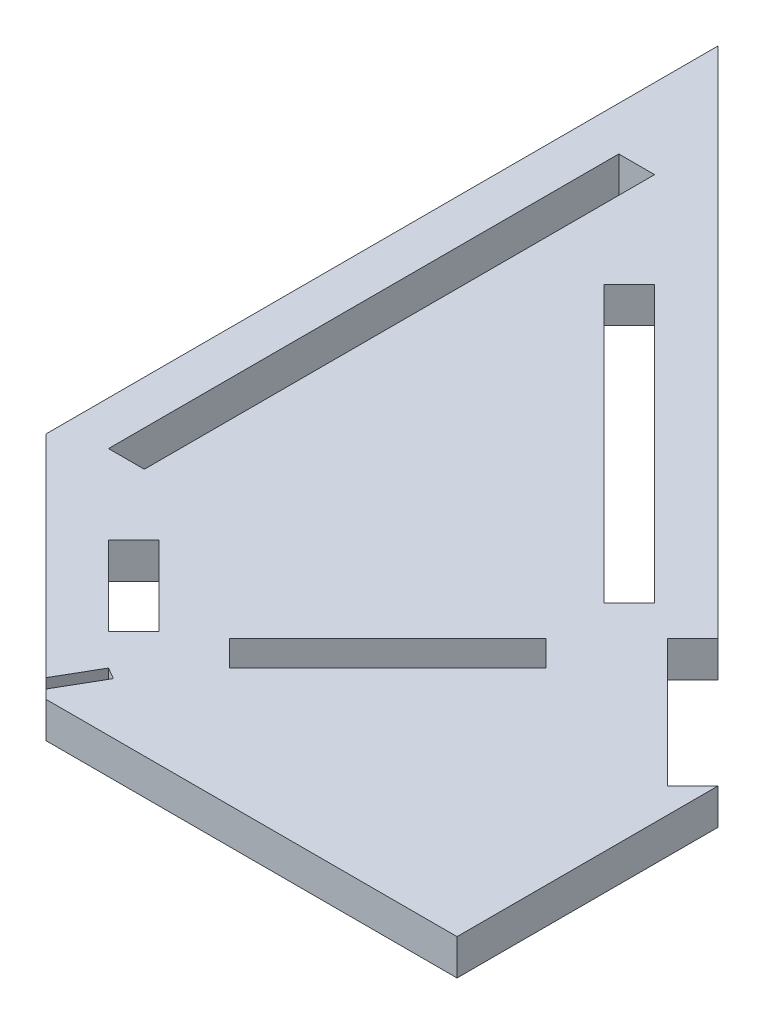
ISO-10303-21;
HEADER;
FILE_DESCRIPTION(('STEP AP214'),'2;1');
FILE_NAME('part.step','',(''),(''),'','','');
FILE_SCHEMA(('AUTOMOTIVE_DESIGN { 1 0 10303 214 1 1 1 1 }'));
ENDSEC;
DATA;
#1=APPLICATION_CONTEXT('core data for automotive mechanical design processes');
#2=APPLICATION_PROTOCOL_DEFINITION('international standard','automotive_design',2000,#1);
#3=PRODUCT_CONTEXT('',#1,'mechanical');
#4=PRODUCT('Part','Part','',(#3));
#5=PRODUCT_RELATED_PRODUCT_CATEGORY('part','',(#4));
#6=PRODUCT_DEFINITION_FORMATION('','',#4);
#7=PRODUCT_DEFINITION_CONTEXT('part definition',#1,'design');
#8=PRODUCT_DEFINITION('design','',#6,#7);
#9=PRODUCT_DEFINITION_SHAPE('','',#8);
#10=(LENGTH_UNIT() NAMED_UNIT(*) SI_UNIT(.MILLI.,.METRE.));
#11=(NAMED_UNIT(*) PLANE_ANGLE_UNIT() SI_UNIT($,.RADIAN.));
#12=(NAMED_UNIT(*) SI_UNIT($,.STERADIAN.) SOLID_ANGLE_UNIT());
#13=UNCERTAINTY_MEASURE_WITH_UNIT(LENGTH_MEASURE(1.E-05),#10,'distance_accuracy_value','');
#14=(GEOMETRIC_REPRESENTATION_CONTEXT(3) GLOBAL_UNCERTAINTY_ASSIGNED_CONTEXT((#13)) GLOBAL_UNIT_ASSIGNED_CONTEXT((#10,
#11,#12)) REPRESENTATION_CONTEXT('',''));
#15=CARTESIAN_POINT('',(0.,0.,0.));
#16=DIRECTION('',(0.,0.,1.));
#17=DIRECTION('',(1.,0.,0.));
#18=AXIS2_PLACEMENT_3D('',#15,#16,#17);
#19=CARTESIAN_POINT('',(9.95590357600012,8.,-9.95590357600016));
#20=DIRECTION('',(0.707106781186546,0.,-0.707106781186549));
#21=DIRECTION('',(-0.707106781186549,0.,-0.707106781186546));
#22=AXIS2_PLACEMENT_3D('',#19,#20,#21);
#23=PLANE('',#22);
#24=DIRECTION('',(0.707106781186549,0.,0.707106781186546));
#25=VECTOR('',#24,1.);
#26=CARTESIAN_POINT('',(9.95590357600012,0.,-9.95590357600016));
#27=LINE('',#26,#25);
#28=CARTESIAN_POINT('',(-47.6387147318105,0.,-67.5505218838106));
#29=VERTEX_POINT('',#28);
#30=CARTESIAN_POINT('',(-41.9818604823181,0.,-61.8936676343182));
#31=VERTEX_POINT('',#30);
#32=EDGE_CURVE('E331',#29,#31,#27,.T.);
#33=ORIENTED_EDGE('',*,*,#32,.T.);
#34=DIRECTION('',(0.,-1.,0.));
#35=VECTOR('',#34,1.);
#36=CARTESIAN_POINT('',(-41.9818604823181,8.,-61.8936676343182));
#37=LINE('',#36,#35);
#38=CARTESIAN_POINT('',(-41.9818604823181,8.,-61.8936676343182));
#39=VERTEX_POINT('',#38);
#40=EDGE_CURVE('E11',#39,#31,#37,.T.);
#41=ORIENTED_EDGE('',*,*,#40,.F.);
#42=DIRECTION('',(0.707106781186549,0.,0.707106781186546));
#43=VECTOR('',#42,1.);
#44=CARTESIAN_POINT('',(9.95590357600012,8.,-9.95590357600016));
#45=LINE('',#44,#43);
#46=CARTESIAN_POINT('',(-47.6387147318105,8.,-67.5505218838106));
#47=VERTEX_POINT('',#46);
#48=EDGE_CURVE('E246',#47,#39,#45,.T.);
#49=ORIENTED_EDGE('',*,*,#48,.F.);
#50=DIRECTION('',(0.,-1.,0.));
#51=VECTOR('',#50,1.);
#52=CARTESIAN_POINT('',(-47.6387147318105,8.,-67.5505218838106));
#53=LINE('',#52,#51);
#54=EDGE_CURVE('E60',#47,#29,#53,.T.);
#55=ORIENTED_EDGE('',*,*,#54,.T.);
#56=EDGE_LOOP('',(#33,#41,#49,#55));
#57=FACE_BOUND('',#56,.T.);
#58=ADVANCED_FACE('F41',(#57),#23,.F.);
#59=CARTESIAN_POINT('',(-51.9377640583183,8.,-51.937764058318));
#60=DIRECTION('',(0.707106781186549,0.,0.707106781186546));
#61=DIRECTION('',(0.707106781186546,0.,-0.707106781186549));
#62=AXIS2_PLACEMENT_3D('',#59,#60,#61);
#63=PLANE('',#62);
#64=DIRECTION('',(-0.707106781186546,0.,0.707106781186549));
#65=VECTOR('',#64,1.);
#66=CARTESIAN_POINT('',(-51.9377640583183,0.,-51.937764058318));
#67=LINE('',#66,#65);
#68=CARTESIAN_POINT('',(-77.3371995416454,0.,-26.5383285749907));
#69=VERTEX_POINT('',#68);
#70=EDGE_CURVE('E252',#31,#69,#67,.T.);
#71=ORIENTED_EDGE('',*,*,#70,.T.);
#72=DIRECTION('',(0.,-1.,0.));
#73=VECTOR('',#72,1.);
#74=CARTESIAN_POINT('',(-77.3371995416454,8.,-26.5383285749907));
#75=LINE('',#74,#73);
#76=CARTESIAN_POINT('',(-77.3371995416454,8.,-26.5383285749907));
#77=VERTEX_POINT('',#76);
#78=EDGE_CURVE('E51',#77,#69,#75,.T.);
#79=ORIENTED_EDGE('',*,*,#78,.F.);
#80=DIRECTION('',(-0.707106781186546,0.,0.707106781186549));
#81=VECTOR('',#80,1.);
#82=CARTESIAN_POINT('',(-51.9377640583183,8.,-51.937764058318));
#83=LINE('',#82,#81);
#84=EDGE_CURVE('E240',#39,#77,#83,.T.);
#85=ORIENTED_EDGE('',*,*,#84,.F.);
#86=ORIENTED_EDGE('',*,*,#40,.T.);
#87=EDGE_LOOP('',(#71,#79,#85,#86));
#88=FACE_BOUND('',#87,.T.);
#89=ADVANCED_FACE('F251',(#88),#63,.F.);
#90=CARTESIAN_POINT('',(-25.3994354833271,8.,25.3994354833272));
#91=DIRECTION('',(0.707106781186545,0.,-0.70710678118655));
#92=DIRECTION('',(-0.70710678118655,0.,-0.707106781186545));
#93=AXIS2_PLACEMENT_3D('',#90,#91,#92);
#94=PLANE('',#93);
#95=DIRECTION('',(0.70710678118655,0.,0.707106781186545));
#96=VECTOR('',#95,1.);
#97=CARTESIAN_POINT('',(-25.3994354833271,0.,25.3994354833272));
#98=LINE('',#97,#96);
#99=CARTESIAN_POINT('',(-82.9940537911378,0.,-32.1951828244831));
#100=VERTEX_POINT('',#99);
#101=EDGE_CURVE('E334',#100,#69,#98,.T.);
#102=ORIENTED_EDGE('',*,*,#101,.F.);
#103=DIRECTION('',(0.,-1.,0.));
#104=VECTOR('',#103,1.);
#105=CARTESIAN_POINT('',(-82.9940537911378,8.,-32.1951828244831));
#106=LINE('',#105,#104);
#107=CARTESIAN_POINT('',(-82.9940537911378,8.,-32.1951828244831));
#108=VERTEX_POINT('',#107);
#109=EDGE_CURVE('E149',#108,#100,#106,.T.);
#110=ORIENTED_EDGE('',*,*,#109,.F.);
#111=DIRECTION('',(0.70710678118655,0.,0.707106781186545));
#112=VECTOR('',#111,1.);
#113=CARTESIAN_POINT('',(-25.3994354833271,8.,25.3994354833272));
#114=LINE('',#113,#112);
#115=EDGE_CURVE('E245',#108,#77,#114,.T.);
#116=ORIENTED_EDGE('',*,*,#115,.T.);
#117=ORIENTED_EDGE('',*,*,#78,.T.);
#118=EDGE_LOOP('',(#102,#110,#116,#117));
#119=FACE_BOUND('',#118,.T.);
#120=ADVANCED_FACE('F256',(#119),#94,.T.);
#121=CARTESIAN_POINT('',(-126.115967493923,8.,-126.115967493922));
#122=DIRECTION('',(0.707106781186551,0.,0.707106781186544));
#123=DIRECTION('',(0.707106781186544,0.,-0.707106781186551));
#124=AXIS2_PLACEMENT_3D('',#121,#122,#123);
#125=PLANE('',#124);
#126=DIRECTION('',(-0.707106781186544,0.,0.707106781186551));
#127=VECTOR('',#126,1.);
#128=CARTESIAN_POINT('',(-126.115967493923,0.,-126.115967493922));
#129=LINE('',#128,#127);
#130=CARTESIAN_POINT('',(-104.059678031826,0.,-148.172256956019));
#131=VERTEX_POINT('',#130);
#132=CARTESIAN_POINT('',(-109.716532281318,0.,-142.515402706527));
#133=VERTEX_POINT('',#132);
#134=EDGE_CURVE('E319',#131,#133,#129,.T.);
#135=ORIENTED_EDGE('',*,*,#134,.F.);
#136=DIRECTION('',(0.,-1.,0.));
#137=VECTOR('',#136,1.);
#138=CARTESIAN_POINT('',(-104.059678031826,8.,-148.172256956019));
#139=LINE('',#138,#137);
#140=CARTESIAN_POINT('',(-104.059678031826,8.,-148.172256956019));
#141=VERTEX_POINT('',#140);
#142=EDGE_CURVE('E341',#141,#131,#139,.T.);
#143=ORIENTED_EDGE('',*,*,#142,.F.);
#144=DIRECTION('',(-0.707106781186544,0.,0.707106781186551));
#145=VECTOR('',#144,1.);
#146=CARTESIAN_POINT('',(-126.115967493923,8.,-126.115967493922));
#147=LINE('',#146,#145);
#148=CARTESIAN_POINT('',(-109.716532281318,8.,-142.515402706527));
#149=VERTEX_POINT('',#148);
#150=EDGE_CURVE('E506',#141,#149,#147,.T.);
#151=ORIENTED_EDGE('',*,*,#150,.T.);
#152=DIRECTION('',(0.,-1.,0.));
#153=VECTOR('',#152,1.);
#154=CARTESIAN_POINT('',(-109.716532281318,8.,-142.515402706527));
#155=LINE('',#154,#153);
#156=EDGE_CURVE('E343',#149,#133,#155,.T.);
#157=ORIENTED_EDGE('',*,*,#156,.T.);
#158=EDGE_LOOP('',(#135,#143,#151,#157));
#159=FACE_BOUND('',#158,.T.);
#160=ADVANCED_FACE('F533',(#159),#125,.T.);
#161=CARTESIAN_POINT('',(22.0562894620972,8.,-22.0562894620974));
#162=DIRECTION('',(-0.707106781186544,0.,0.707106781186551));
#163=DIRECTION('',(0.707106781186551,0.,0.707106781186544));
#164=AXIS2_PLACEMENT_3D('',#161,#162,#163);
#165=PLANE('',#164);
#166=DIRECTION('',(-0.707106781186551,0.,-0.707106781186544));
#167=VECTOR('',#166,1.);
#168=CARTESIAN_POINT('',(22.0562894620972,0.,-22.0562894620974));
#169=LINE('',#168,#167);
#170=CARTESIAN_POINT('',(-42.4282509836061,0.,-86.5408299078));
#171=VERTEX_POINT('',#170);
#172=EDGE_CURVE('E322',#171,#131,#169,.T.);
#173=ORIENTED_EDGE('',*,*,#172,.F.);
#174=DIRECTION('',(0.,-1.,0.));
#175=VECTOR('',#174,1.);
#176=CARTESIAN_POINT('',(-42.4282509836061,8.,-86.5408299078));
#177=LINE('',#176,#175);
#178=CARTESIAN_POINT('',(-42.4282509836061,8.,-86.5408299078));
#179=VERTEX_POINT('',#178);
#180=EDGE_CURVE('E348',#179,#171,#177,.T.);
#181=ORIENTED_EDGE('',*,*,#180,.F.);
#182=DIRECTION('',(-0.707106781186551,0.,-0.707106781186544));
#183=VECTOR('',#182,1.);
#184=CARTESIAN_POINT('',(22.0562894620972,8.,-22.0562894620974));
#185=LINE('',#184,#183);
#186=EDGE_CURVE('E509',#179,#141,#185,.T.);
#187=ORIENTED_EDGE('',*,*,#186,.T.);
#188=ORIENTED_EDGE('',*,*,#142,.T.);
#189=EDGE_LOOP('',(#173,#181,#187,#188));
#190=FACE_BOUND('',#189,.T.);
#191=ADVANCED_FACE('F535',(#190),#165,.T.);
#192=CARTESIAN_POINT('',(-64.4845404457033,8.,-64.4845404457025));
#193=DIRECTION('',(-0.707106781186552,0.,-0.707106781186543));
#194=DIRECTION('',(-0.707106781186543,0.,0.707106781186552));
#195=AXIS2_PLACEMENT_3D('',#192,#193,#194);
#196=PLANE('',#195);
#197=DIRECTION('',(0.707106781186543,0.,-0.707106781186552));
#198=VECTOR('',#197,1.);
#199=CARTESIAN_POINT('',(-64.4845404457033,0.,-64.4845404457025));
#200=LINE('',#199,#198);
#201=CARTESIAN_POINT('',(-48.0851052330985,0.,-80.8839756583076));
#202=VERTEX_POINT('',#201);
#203=EDGE_CURVE('E325',#202,#171,#200,.T.);
#204=ORIENTED_EDGE('',*,*,#203,.F.);
#205=DIRECTION('',(0.,-1.,0.));
#206=VECTOR('',#205,1.);
#207=CARTESIAN_POINT('',(-48.0851052330985,8.,-80.8839756583076));
#208=LINE('',#207,#206);
#209=CARTESIAN_POINT('',(-48.0851052330985,8.,-80.8839756583076));
#210=VERTEX_POINT('',#209);
#211=EDGE_CURVE('E345',#210,#202,#208,.T.);
#212=ORIENTED_EDGE('',*,*,#211,.F.);
#213=DIRECTION('',(0.707106781186543,0.,-0.707106781186552));
#214=VECTOR('',#213,1.);
#215=CARTESIAN_POINT('',(-64.4845404457033,8.,-64.4845404457025));
#216=LINE('',#215,#214);
#217=EDGE_CURVE('E512',#210,#179,#216,.T.);
#218=ORIENTED_EDGE('',*,*,#217,.T.);
#219=ORIENTED_EDGE('',*,*,#180,.T.);
#220=EDGE_LOOP('',(#204,#212,#218,#219));
#221=FACE_BOUND('',#220,.T.);
#222=ADVANCED_FACE('F527',(#221),#196,.T.);
#223=CARTESIAN_POINT('',(-76.6865013998526,8.,-76.6865013998517));
#224=DIRECTION('',(0.707106781186552,0.,0.707106781186543));
#225=DIRECTION('',(0.707106781186543,0.,-0.707106781186552));
#226=AXIS2_PLACEMENT_3D('',#223,#224,#225);
#227=PLANE('',#226);
#228=DIRECTION('',(-0.707106781186543,0.,0.707106781186552));
#229=VECTOR('',#228,1.);
#230=CARTESIAN_POINT('',(-76.6865013998526,0.,-76.6865013998517));
#231=LINE('',#230,#229);
#232=CARTESIAN_POINT('',(-109.938357688264,0.,-43.4346451114395));
#233=VERTEX_POINT('',#232);
#234=CARTESIAN_POINT('',(-115.595211937757,0.,-37.7777908619471));
#235=VERTEX_POINT('',#234);
#236=EDGE_CURVE('E307',#233,#235,#231,.T.);
#237=ORIENTED_EDGE('',*,*,#236,.F.);
#238=DIRECTION('',(0.,-1.,0.));
#239=VECTOR('',#238,1.);
#240=CARTESIAN_POINT('',(-109.938357688264,8.,-43.4346451114395));
#241=LINE('',#240,#239);
#242=CARTESIAN_POINT('',(-109.938357688264,8.,-43.4346451114395));
#243=VERTEX_POINT('',#242);
#244=EDGE_CURVE('E346',#243,#233,#241,.T.);
#245=ORIENTED_EDGE('',*,*,#244,.F.);
#246=DIRECTION('',(-0.707106781186543,0.,0.707106781186552));
#247=VECTOR('',#246,1.);
#248=CARTESIAN_POINT('',(-76.6865013998526,8.,-76.6865013998517));
#249=LINE('',#248,#247);
#250=CARTESIAN_POINT('',(-115.595211937757,8.,-37.7777908619471));
#251=VERTEX_POINT('',#250);
#252=EDGE_CURVE('E494',#243,#251,#249,.T.);
#253=ORIENTED_EDGE('',*,*,#252,.T.);
#254=DIRECTION('',(0.,-1.,0.));
#255=VECTOR('',#254,1.);
#256=CARTESIAN_POINT('',(-115.595211937757,8.,-37.7777908619471));
#257=LINE('',#256,#255);
#258=EDGE_CURVE('E351',#251,#235,#257,.T.);
#259=ORIENTED_EDGE('',*,*,#258,.T.);
#260=EDGE_LOOP('',(#237,#245,#253,#259));
#261=FACE_BOUND('',#260,.T.);
#262=ADVANCED_FACE('F542',(#261),#227,.T.);
#263=CARTESIAN_POINT('',(-33.2518562884118,8.,33.2518562884122));
#264=DIRECTION('',(-0.707106781186543,0.,0.707106781186552));
#265=DIRECTION('',(0.707106781186552,0.,0.707106781186543));
#266=AXIS2_PLACEMENT_3D('',#263,#264,#265);
#267=PLANE('',#266);
#268=DIRECTION('',(-0.707106781186552,0.,-0.707106781186543));
#269=VECTOR('',#268,1.);
#270=CARTESIAN_POINT('',(-33.2518562884118,0.,33.2518562884122));
#271=LINE('',#270,#269);
#272=CARTESIAN_POINT('',(-92.2606881586006,0.,-25.7569755817759));
#273=VERTEX_POINT('',#272);
#274=EDGE_CURVE('E310',#273,#233,#271,.T.);
#275=ORIENTED_EDGE('',*,*,#274,.F.);
#276=DIRECTION('',(0.,-1.,0.));
#277=VECTOR('',#276,1.);
#278=CARTESIAN_POINT('',(-92.2606881586006,8.,-25.7569755817759));
#279=LINE('',#278,#277);
#280=CARTESIAN_POINT('',(-92.2606881586006,8.,-25.7569755817759));
#281=VERTEX_POINT('',#280);
#282=EDGE_CURVE('E356',#281,#273,#279,.T.);
#283=ORIENTED_EDGE('',*,*,#282,.F.);
#284=DIRECTION('',(-0.707106781186552,0.,-0.707106781186543));
#285=VECTOR('',#284,1.);
#286=CARTESIAN_POINT('',(-33.2518562884118,8.,33.2518562884122));
#287=LINE('',#286,#285);
#288=EDGE_CURVE('E497',#281,#243,#287,.T.);
#289=ORIENTED_EDGE('',*,*,#288,.T.);
#290=ORIENTED_EDGE('',*,*,#244,.T.);
#291=EDGE_LOOP('',(#275,#283,#289,#290));
#292=FACE_BOUND('',#291,.T.);
#293=ADVANCED_FACE('F612',(#292),#267,.T.);
#294=CARTESIAN_POINT('',(-59.0088318701887,8.,-59.0088318701881));
#295=DIRECTION('',(-0.707106781186551,0.,-0.707106781186544));
#296=DIRECTION('',(-0.707106781186544,0.,0.707106781186551));
#297=AXIS2_PLACEMENT_3D('',#294,#295,#296);
#298=PLANE('',#297);
#299=DIRECTION('',(0.707106781186544,0.,-0.707106781186551));
#300=VECTOR('',#299,1.);
#301=CARTESIAN_POINT('',(-59.0088318701887,0.,-59.0088318701881));
#302=LINE('',#301,#300);
#303=CARTESIAN_POINT('',(-97.9175424080929,0.,-20.1001213322835));
#304=VERTEX_POINT('',#303);
#305=EDGE_CURVE('E313',#304,#273,#302,.T.);
#306=ORIENTED_EDGE('',*,*,#305,.F.);
#307=DIRECTION('',(0.,-1.,0.));
#308=VECTOR('',#307,1.);
#309=CARTESIAN_POINT('',(-97.9175424080929,8.,-20.1001213322835));
#310=LINE('',#309,#308);
#311=CARTESIAN_POINT('',(-97.9175424080929,8.,-20.1001213322835));
#312=VERTEX_POINT('',#311);
#313=EDGE_CURVE('E353',#312,#304,#310,.T.);
#314=ORIENTED_EDGE('',*,*,#313,.F.);
#315=DIRECTION('',(0.707106781186544,0.,-0.707106781186551));
#316=VECTOR('',#315,1.);
#317=CARTESIAN_POINT('',(-59.0088318701887,8.,-59.0088318701881));
#318=LINE('',#317,#316);
#319=EDGE_CURVE('E500',#312,#281,#318,.T.);
#320=ORIENTED_EDGE('',*,*,#319,.T.);
#321=ORIENTED_EDGE('',*,*,#282,.T.);
#322=EDGE_LOOP('',(#306,#314,#320,#321));
#323=FACE_BOUND('',#322,.T.);
#324=ADVANCED_FACE('F607',(#323),#298,.T.);
#325=CARTESIAN_POINT('',(1.92399778024874E-13,8.,-55.4554603916151));
#326=DIRECTION('',(0.,0.,-1.));
#327=DIRECTION('',(-1.,0.,0.));
#328=AXIS2_PLACEMENT_3D('',#325,#326,#327);
#329=PLANE('',#328);
#330=DIRECTION('',(1.,0.,0.));
#331=VECTOR('',#330,1.);
#332=CARTESIAN_POINT('',(1.92399778024874E-13,0.,-55.4554603916151));
#333=LINE('',#332,#331);
#334=CARTESIAN_POINT('',(-133.272881467423,0.,-55.4554603916156));
#335=VERTEX_POINT('',#334);
#336=CARTESIAN_POINT('',(-125.272881467423,0.,-55.4554603916155));
#337=VERTEX_POINT('',#336);
#338=EDGE_CURVE('E295',#335,#337,#333,.T.);
#339=ORIENTED_EDGE('',*,*,#338,.F.);
#340=DIRECTION('',(0.,-1.,0.));
#341=VECTOR('',#340,1.);
#342=CARTESIAN_POINT('',(-133.272881467423,8.,-55.4554603916156));
#343=LINE('',#342,#341);
#344=CARTESIAN_POINT('',(-133.272881467423,8.,-55.4554603916156));
#345=VERTEX_POINT('',#344);
#346=EDGE_CURVE('E354',#345,#335,#343,.T.);
#347=ORIENTED_EDGE('',*,*,#346,.F.);
#348=DIRECTION('',(1.,0.,0.));
#349=VECTOR('',#348,1.);
#350=CARTESIAN_POINT('',(1.92399778024874E-13,8.,-55.4554603916151));
#351=LINE('',#350,#349);
#352=CARTESIAN_POINT('',(-125.272881467423,8.,-55.4554603916155));
#353=VERTEX_POINT('',#352);
#354=EDGE_CURVE('E482',#345,#353,#351,.T.);
#355=ORIENTED_EDGE('',*,*,#354,.T.);
#356=DIRECTION('',(0.,-1.,0.));
#357=VECTOR('',#356,1.);
#358=CARTESIAN_POINT('',(-125.272881467423,8.,-55.4554603916155));
#359=LINE('',#358,#357);
#360=EDGE_CURVE('E359',#353,#337,#359,.T.);
#361=ORIENTED_EDGE('',*,*,#360,.T.);
#362=EDGE_LOOP('',(#339,#347,#355,#361));
#363=FACE_BOUND('',#362,.T.);
#364=ADVANCED_FACE('F600',(#363),#329,.T.);
#365=CARTESIAN_POINT('',(-133.272881467423,8.,-3.89614556911979E-13));
#366=DIRECTION('',(1.,0.,0.));
#367=DIRECTION('',(0.,0.,-1.));
#368=AXIS2_PLACEMENT_3D('',#365,#366,#367);
#369=PLANE('',#368);
#370=DIRECTION('',(0.,0.,1.));
#371=VECTOR('',#370,1.);
#372=CARTESIAN_POINT('',(-133.272881467423,0.,-3.89614556911979E-13));
#373=LINE('',#372,#371);
#374=CARTESIAN_POINT('',(-133.272881467423,0.,-169.385460391616));
#375=VERTEX_POINT('',#374);
#376=EDGE_CURVE('E298',#375,#335,#373,.T.);
#377=ORIENTED_EDGE('',*,*,#376,.F.);
#378=DIRECTION('',(0.,-1.,0.));
#379=VECTOR('',#378,1.);
#380=CARTESIAN_POINT('',(-133.272881467423,8.,-169.385460391616));
#381=LINE('',#380,#379);
#382=CARTESIAN_POINT('',(-133.272881467423,8.,-169.385460391616));
#383=VERTEX_POINT('',#382);
#384=EDGE_CURVE('E363',#383,#375,#381,.T.);
#385=ORIENTED_EDGE('',*,*,#384,.F.);
#386=DIRECTION('',(0.,0.,1.));
#387=VECTOR('',#386,1.);
#388=CARTESIAN_POINT('',(-133.272881467423,8.,-3.89614556911979E-13));
#389=LINE('',#388,#387);
#390=EDGE_CURVE('E485',#383,#345,#389,.T.);
#391=ORIENTED_EDGE('',*,*,#390,.T.);
#392=ORIENTED_EDGE('',*,*,#346,.T.);
#393=EDGE_LOOP('',(#377,#385,#391,#392));
#394=FACE_BOUND('',#393,.T.);
#395=ADVANCED_FACE('F594',(#394),#369,.T.);
#396=CARTESIAN_POINT('',(5.87673869260948E-13,8.,-169.385460391615));
#397=DIRECTION('',(0.,0.,1.));
#398=DIRECTION('',(1.,0.,0.));
#399=AXIS2_PLACEMENT_3D('',#396,#397,#398);
#400=PLANE('',#399);
#401=DIRECTION('',(-1.,0.,0.));
#402=VECTOR('',#401,1.);
#403=CARTESIAN_POINT('',(5.87673869260948E-13,0.,-169.385460391615));
#404=LINE('',#403,#402);
#405=CARTESIAN_POINT('',(-125.272881467423,0.,-169.385460391616));
#406=VERTEX_POINT('',#405);
#407=EDGE_CURVE('E301',#406,#375,#404,.T.);
#408=ORIENTED_EDGE('',*,*,#407,.F.);
#409=DIRECTION('',(0.,-1.,0.));
#410=VECTOR('',#409,1.);
#411=CARTESIAN_POINT('',(-125.272881467423,8.,-169.385460391616));
#412=LINE('',#411,#410);
#413=CARTESIAN_POINT('',(-125.272881467423,8.,-169.385460391616));
#414=VERTEX_POINT('',#413);
#415=EDGE_CURVE('E361',#414,#406,#412,.T.);
#416=ORIENTED_EDGE('',*,*,#415,.F.);
#417=DIRECTION('',(-1.,0.,0.));
#418=VECTOR('',#417,1.);
#419=CARTESIAN_POINT('',(5.87673869260948E-13,8.,-169.385460391615));
#420=LINE('',#419,#418);
#421=EDGE_CURVE('E488',#414,#383,#420,.T.);
#422=ORIENTED_EDGE('',*,*,#421,.T.);
#423=ORIENTED_EDGE('',*,*,#384,.T.);
#424=EDGE_LOOP('',(#408,#416,#422,#423));
#425=FACE_BOUND('',#424,.T.);
#426=ADVANCED_FACE('F590',(#425),#400,.T.);
#427=CARTESIAN_POINT('',(-57.5946183078117,8.,-57.5946183078113));
#428=DIRECTION('',(0.70710678118655,0.,0.707106781186545));
#429=DIRECTION('',(0.707106781186545,0.,-0.70710678118655));
#430=AXIS2_PLACEMENT_3D('',#427,#428,#429);
#431=PLANE('',#430);
#432=DIRECTION('',(-0.707106781186545,0.,0.70710678118655));
#433=VECTOR('',#432,1.);
#434=CARTESIAN_POINT('',(-57.5946183078117,0.,-57.5946183078113));
#435=LINE('',#434,#433);
#436=CARTESIAN_POINT('',(-28.4696183078116,0.,-86.7196183078117));
#437=VERTEX_POINT('',#436);
#438=CARTESIAN_POINT('',(-34.1264725573039,0.,-81.0627640583193));
#439=VERTEX_POINT('',#438);
#440=EDGE_CURVE('E263',#437,#439,#435,.T.);
#441=ORIENTED_EDGE('',*,*,#440,.F.);
#442=DIRECTION('',(0.,-1.,0.));
#443=VECTOR('',#442,1.);
#444=CARTESIAN_POINT('',(-28.4696183078116,8.,-86.7196183078117));
#445=LINE('',#444,#443);
#446=CARTESIAN_POINT('',(-28.4696183078116,8.,-86.7196183078117));
#447=VERTEX_POINT('',#446);
#448=EDGE_CURVE('E45',#447,#437,#445,.T.);
#449=ORIENTED_EDGE('',*,*,#448,.F.);
#450=DIRECTION('',(-0.707106781186545,0.,0.70710678118655));
#451=VECTOR('',#450,1.);
#452=CARTESIAN_POINT('',(-57.5946183078117,8.,-57.5946183078113));
#453=LINE('',#452,#451);
#454=CARTESIAN_POINT('',(-34.1264725573039,8.,-81.0627640583193));
#455=VERTEX_POINT('',#454);
#456=EDGE_CURVE('E339',#447,#455,#453,.T.);
#457=ORIENTED_EDGE('',*,*,#456,.T.);
#458=DIRECTION('',(0.,-1.,0.));
#459=VECTOR('',#458,1.);
#460=CARTESIAN_POINT('',(-34.1264725573039,8.,-81.0627640583193));
#461=LINE('',#460,#459);
#462=EDGE_CURVE('E259',#455,#439,#461,.T.);
#463=ORIENTED_EDGE('',*,*,#462,.T.);
#464=EDGE_LOOP('',(#441,#449,#457,#463));
#465=FACE_BOUND('',#464,.T.);
#466=ADVANCED_FACE('F43',(#465),#431,.T.);
#467=CARTESIAN_POINT('',(29.1250000000001,8.,-29.1250000000003));
#468=DIRECTION('',(-0.707106781186546,0.,0.707106781186549));
#469=DIRECTION('',(0.707106781186549,0.,0.707106781186546));
#470=AXIS2_PLACEMENT_3D('',#467,#468,#469);
#471=PLANE('',#470);
#472=DIRECTION('',(-0.707106781186549,0.,-0.707106781186546));
#473=VECTOR('',#472,1.);
#474=CARTESIAN_POINT('',(29.1250000000001,0.,-29.1250000000003));
#475=LINE('',#474,#473);
#476=CARTESIAN_POINT('',(-143.078881246332,0.,-201.328881246331));
#477=VERTEX_POINT('',#476);
#478=EDGE_CURVE('E266',#437,#477,#475,.T.);
#479=ORIENTED_EDGE('',*,*,#478,.T.);
#480=DIRECTION('',(0.,-1.,0.));
#481=VECTOR('',#480,1.);
#482=CARTESIAN_POINT('',(-143.078881246332,8.,-201.328881246331));
#483=LINE('',#482,#481);
#484=CARTESIAN_POINT('',(-143.078881246332,8.,-201.328881246331));
#485=VERTEX_POINT('',#484);
#486=EDGE_CURVE('E390',#485,#477,#483,.T.);
#487=ORIENTED_EDGE('',*,*,#486,.F.);
#488=DIRECTION('',(-0.707106781186549,0.,-0.707106781186546));
#489=VECTOR('',#488,1.);
#490=CARTESIAN_POINT('',(29.1250000000001,8.,-29.1250000000003));
#491=LINE('',#490,#489);
#492=EDGE_CURVE('E399',#447,#485,#491,.T.);
#493=ORIENTED_EDGE('',*,*,#492,.F.);
#494=ORIENTED_EDGE('',*,*,#448,.T.);
#495=EDGE_LOOP('',(#479,#487,#493,#494));
#496=FACE_BOUND('',#495,.T.);
#497=ADVANCED_FACE('F398',(#496),#471,.F.);
#498=CARTESIAN_POINT('',(-143.078881246332,8.,0.));
#499=DIRECTION('',(1.,0.,0.));
#500=DIRECTION('',(0.,0.,-1.));
#501=AXIS2_PLACEMENT_3D('',#498,#499,#500);
#502=PLANE('',#501);
#503=DIRECTION('',(0.,0.,1.));
#504=VECTOR('',#503,1.);
#505=CARTESIAN_POINT('',(-143.078881246332,0.,0.));
#506=LINE('',#505,#504);
#507=CARTESIAN_POINT('',(-143.078881246332,0.,-51.3288812463314));
#508=VERTEX_POINT('',#507);
#509=EDGE_CURVE('E268',#477,#508,#506,.T.);
#510=ORIENTED_EDGE('',*,*,#509,.T.);
#511=DIRECTION('',(0.,-1.,0.));
#512=VECTOR('',#511,1.);
#513=CARTESIAN_POINT('',(-143.078881246332,8.,-51.3288812463314));
#514=LINE('',#513,#512);
#515=CARTESIAN_POINT('',(-143.078881246332,8.,-51.3288812463314));
#516=VERTEX_POINT('',#515);
#517=EDGE_CURVE('E388',#516,#508,#514,.T.);
#518=ORIENTED_EDGE('',*,*,#517,.F.);
#519=DIRECTION('',(0.,0.,1.));
#520=VECTOR('',#519,1.);
#521=CARTESIAN_POINT('',(-143.078881246332,8.,0.));
#522=LINE('',#521,#520);
#523=EDGE_CURVE('E467',#485,#516,#522,.T.);
#524=ORIENTED_EDGE('',*,*,#523,.F.);
#525=ORIENTED_EDGE('',*,*,#486,.T.);
#526=EDGE_LOOP('',(#510,#518,#524,#525));
#527=FACE_BOUND('',#526,.T.);
#528=ADVANCED_FACE('F466',(#527),#502,.F.);
#529=CARTESIAN_POINT('',(-45.8749999999998,8.,45.875));
#530=DIRECTION('',(0.707106781186546,0.,-0.707106781186549));
#531=DIRECTION('',(-0.707106781186549,0.,-0.707106781186546));
#532=AXIS2_PLACEMENT_3D('',#529,#530,#531);
#533=PLANE('',#532);
#534=DIRECTION('',(0.707106781186549,0.,0.707106781186546));
#535=VECTOR('',#534,1.);
#536=CARTESIAN_POINT('',(-45.8749999999998,0.,45.875));
#537=LINE('',#536,#535);
#538=CARTESIAN_POINT('',(-95.9461524227132,0.,-4.19615242271321));
#539=VERTEX_POINT('',#538);
#540=EDGE_CURVE('E271',#508,#539,#537,.T.);
#541=ORIENTED_EDGE('',*,*,#540,.T.);
#542=DIRECTION('',(0.,-1.,0.));
#543=VECTOR('',#542,1.);
#544=CARTESIAN_POINT('',(-95.9461524227132,8.,-4.19615242271321));
#545=LINE('',#544,#543);
#546=CARTESIAN_POINT('',(-95.9461524227132,8.,-4.19615242271321));
#547=VERTEX_POINT('',#546);
#548=EDGE_CURVE('E386',#547,#539,#545,.T.);
#549=ORIENTED_EDGE('',*,*,#548,.F.);
#550=DIRECTION('',(0.707106781186549,0.,0.707106781186546));
#551=VECTOR('',#550,1.);
#552=CARTESIAN_POINT('',(-45.8749999999998,8.,45.875));
#553=LINE('',#552,#551);
#554=EDGE_CURVE('E465',#516,#547,#553,.T.);
#555=ORIENTED_EDGE('',*,*,#554,.F.);
#556=ORIENTED_EDGE('',*,*,#517,.T.);
#557=EDGE_LOOP('',(#541,#549,#555,#556));
#558=FACE_BOUND('',#557,.T.);
#559=ADVANCED_FACE('F463',(#558),#533,.F.);
#560=CARTESIAN_POINT('',(-73.7766016151456,8.,-42.5949408024));
#561=DIRECTION('',(0.866025403784439,0.,0.499999999999999));
#562=DIRECTION('',(0.499999999999999,0.,-0.866025403784439));
#563=AXIS2_PLACEMENT_3D('',#560,#561,#562);
#564=PLANE('',#563);
#565=DIRECTION('',(-0.499999999999999,0.,0.866025403784439));
#566=VECTOR('',#565,1.);
#567=CARTESIAN_POINT('',(-73.7766016151456,0.,-42.5949408024));
#568=LINE('',#567,#566);
#569=CARTESIAN_POINT('',(-90.8464745962277,0.,-13.0290535204186));
#570=VERTEX_POINT('',#569);
#571=EDGE_CURVE('E274',#570,#539,#568,.T.);
#572=ORIENTED_EDGE('',*,*,#571,.F.);
#573=DIRECTION('',(0.,-1.,0.));
#574=VECTOR('',#573,1.);
#575=CARTESIAN_POINT('',(-90.8464745962277,8.,-13.0290535204186));
#576=LINE('',#575,#574);
#577=CARTESIAN_POINT('',(-90.8464745962277,8.,-13.0290535204186));
#578=VERTEX_POINT('',#577);
#579=EDGE_CURVE('E384',#578,#570,#576,.T.);
#580=ORIENTED_EDGE('',*,*,#579,.F.);
#581=DIRECTION('',(-0.499999999999999,0.,0.866025403784439));
#582=VECTOR('',#581,1.);
#583=CARTESIAN_POINT('',(-73.7766016151456,8.,-42.5949408024));
#584=LINE('',#583,#582);
#585=EDGE_CURVE('E460',#578,#547,#584,.T.);
#586=ORIENTED_EDGE('',*,*,#585,.T.);
#587=ORIENTED_EDGE('',*,*,#548,.T.);
#588=EDGE_LOOP('',(#572,#580,#586,#587));
#589=FACE_BOUND('',#588,.T.);
#590=ADVANCED_FACE('F458',(#589),#564,.T.);
#591=CARTESIAN_POINT('',(-17.069872981082,8.,29.5658872819814));
#592=DIRECTION('',(-0.499999999999999,0.,0.86602540378444));
#593=DIRECTION('',(0.86602540378444,0.,0.499999999999999));
#594=AXIS2_PLACEMENT_3D('',#591,#592,#593);
#595=PLANE('',#594);
#596=DIRECTION('',(-0.86602540378444,0.,-0.499999999999999));
#597=VECTOR('',#596,1.);
#598=CARTESIAN_POINT('',(-17.069872981082,0.,29.5658872819814));
#599=LINE('',#598,#597);
#600=CARTESIAN_POINT('',(-88.2483983848743,0.,-11.5290535204186));
#601=VERTEX_POINT('',#600);
#602=EDGE_CURVE('E277',#601,#570,#599,.T.);
#603=ORIENTED_EDGE('',*,*,#602,.F.);
#604=DIRECTION('',(0.,-1.,0.));
#605=VECTOR('',#604,1.);
#606=CARTESIAN_POINT('',(-88.2483983848743,8.,-11.5290535204186));
#607=LINE('',#606,#605);
#608=CARTESIAN_POINT('',(-88.2483983848743,8.,-11.5290535204186));
#609=VERTEX_POINT('',#608);
#610=EDGE_CURVE('E382',#609,#601,#607,.T.);
#611=ORIENTED_EDGE('',*,*,#610,.F.);
#612=DIRECTION('',(-0.86602540378444,0.,-0.499999999999999));
#613=VECTOR('',#612,1.);
#614=CARTESIAN_POINT('',(-17.069872981082,8.,29.5658872819814));
#615=LINE('',#614,#613);
#616=EDGE_CURVE('E454',#609,#578,#615,.T.);
#617=ORIENTED_EDGE('',*,*,#616,.T.);
#618=ORIENTED_EDGE('',*,*,#579,.T.);
#619=EDGE_LOOP('',(#603,#611,#617,#618));
#620=FACE_BOUND('',#619,.T.);
#621=ADVANCED_FACE('F451',(#620),#595,.T.);
#622=CARTESIAN_POINT('',(-71.1785254037924,8.,-41.0949408023999));
#623=DIRECTION('',(-0.86602540378444,0.,-0.499999999999998));
#624=DIRECTION('',(-0.499999999999998,0.,0.86602540378444));
#625=AXIS2_PLACEMENT_3D('',#622,#623,#624);
#626=PLANE('',#625);
#627=DIRECTION('',(0.499999999999998,0.,-0.86602540378444));
#628=VECTOR('',#627,1.);
#629=CARTESIAN_POINT('',(-71.1785254037924,0.,-41.0949408023999));
#630=LINE('',#629,#628);
#631=CARTESIAN_POINT('',(-93.7500000000066,0.,-2.00000000000656));
#632=VERTEX_POINT('',#631);
#633=EDGE_CURVE('E280',#632,#601,#630,.T.);
#634=ORIENTED_EDGE('',*,*,#633,.F.);
#635=DIRECTION('',(0.,-1.,0.));
#636=VECTOR('',#635,1.);
#637=CARTESIAN_POINT('',(-93.7500000000066,8.,-2.00000000000656));
#638=LINE('',#637,#636);
#639=CARTESIAN_POINT('',(-93.7500000000066,8.,-2.00000000000656));
#640=VERTEX_POINT('',#639);
#641=EDGE_CURVE('E380',#640,#632,#638,.T.);
#642=ORIENTED_EDGE('',*,*,#641,.F.);
#643=DIRECTION('',(0.499999999999998,0.,-0.86602540378444));
#644=VECTOR('',#643,1.);
#645=CARTESIAN_POINT('',(-71.1785254037924,8.,-41.0949408023999));
#646=LINE('',#645,#644);
#647=EDGE_CURVE('E447',#640,#609,#646,.T.);
#648=ORIENTED_EDGE('',*,*,#647,.T.);
#649=ORIENTED_EDGE('',*,*,#610,.T.);
#650=EDGE_LOOP('',(#634,#642,#648,#649));
#651=FACE_BOUND('',#650,.T.);
#652=ADVANCED_FACE('F446',(#651),#626,.T.);
#653=CARTESIAN_POINT('',(-45.8749999999999,8.,45.875));
#654=DIRECTION('',(0.707106781186547,0.,-0.707106781186548));
#655=DIRECTION('',(-0.707106781186548,0.,-0.707106781186547));
#656=AXIS2_PLACEMENT_3D('',#653,#654,#655);
#657=PLANE('',#656);
#658=DIRECTION('',(0.707106781186548,0.,0.707106781186547));
#659=VECTOR('',#658,1.);
#660=CARTESIAN_POINT('',(-45.8749999999999,0.,45.875));
#661=LINE('',#660,#659);
#662=CARTESIAN_POINT('',(-91.75,0.,0.));
#663=VERTEX_POINT('',#662);
#664=EDGE_CURVE('E283',#632,#663,#661,.T.);
#665=ORIENTED_EDGE('',*,*,#664,.T.);
#666=DIRECTION('',(0.,-1.,0.));
#667=VECTOR('',#666,1.);
#668=CARTESIAN_POINT('',(-91.75,8.,0.));
#669=LINE('',#668,#667);
#670=CARTESIAN_POINT('',(-91.75,8.,0.));
#671=VERTEX_POINT('',#670);
#672=EDGE_CURVE('E377',#671,#663,#669,.T.);
#673=ORIENTED_EDGE('',*,*,#672,.F.);
#674=DIRECTION('',(0.707106781186548,0.,0.707106781186547));
#675=VECTOR('',#674,1.);
#676=CARTESIAN_POINT('',(-45.8749999999999,8.,45.875));
#677=LINE('',#676,#675);
#678=EDGE_CURVE('E442',#640,#671,#677,.T.);
#679=ORIENTED_EDGE('',*,*,#678,.F.);
#680=ORIENTED_EDGE('',*,*,#641,.T.);
#681=EDGE_LOOP('',(#665,#673,#679,#680));
#682=FACE_BOUND('',#681,.T.);
#683=ADVANCED_FACE('F441',(#682),#657,.F.);
#684=CARTESIAN_POINT('',(0.,8.,0.));
#685=DIRECTION('',(0.,0.,-1.));
#686=DIRECTION('',(-1.,0.,0.));
#687=AXIS2_PLACEMENT_3D('',#684,#685,#686);
#688=PLANE('',#687);
#689=DIRECTION('',(1.,0.,0.));
#690=VECTOR('',#689,1.);
#691=CARTESIAN_POINT('',(0.,0.,0.));
#692=LINE('',#691,#690);
#693=CARTESIAN_POINT('',(0.,0.,0.));
#694=VERTEX_POINT('',#693);
#695=EDGE_CURVE('E285',#663,#694,#692,.T.);
#696=ORIENTED_EDGE('',*,*,#695,.T.);
#697=DIRECTION('',(0.,-1.,0.));
#698=VECTOR('',#697,1.);
#699=CARTESIAN_POINT('',(0.,8.,0.));
#700=LINE('',#699,#698);
#701=CARTESIAN_POINT('',(0.,8.,0.));
#702=VERTEX_POINT('',#701);
#703=EDGE_CURVE('E374',#702,#694,#700,.T.);
#704=ORIENTED_EDGE('',*,*,#703,.F.);
#705=DIRECTION('',(1.,0.,0.));
#706=VECTOR('',#705,1.);
#707=CARTESIAN_POINT('',(0.,8.,0.));
#708=LINE('',#707,#706);
#709=EDGE_CURVE('E438',#671,#702,#708,.T.);
#710=ORIENTED_EDGE('',*,*,#709,.F.);
#711=ORIENTED_EDGE('',*,*,#672,.T.);
#712=EDGE_LOOP('',(#696,#704,#710,#711));
#713=FACE_BOUND('',#712,.T.);
#714=ADVANCED_FACE('F435',(#713),#688,.F.);
#715=CARTESIAN_POINT('',(0.,8.,0.));
#716=DIRECTION('',(-1.,0.,0.));
#717=DIRECTION('',(0.,0.,1.));
#718=AXIS2_PLACEMENT_3D('',#715,#716,#717);
#719=PLANE('',#718);
#720=DIRECTION('',(0.,0.,-1.));
#721=VECTOR('',#720,1.);
#722=CARTESIAN_POINT('',(0.,0.,0.));
#723=LINE('',#722,#721);
#724=CARTESIAN_POINT('',(0.,0.,-58.2500000000003));
#725=VERTEX_POINT('',#724);
#726=EDGE_CURVE('E287',#694,#725,#723,.T.);
#727=ORIENTED_EDGE('',*,*,#726,.T.);
#728=DIRECTION('',(0.,-1.,0.));
#729=VECTOR('',#728,1.);
#730=CARTESIAN_POINT('',(0.,8.,-58.2500000000003));
#731=LINE('',#730,#729);
#732=CARTESIAN_POINT('',(0.,8.,-58.2500000000003));
#733=VERTEX_POINT('',#732);
#734=EDGE_CURVE('E371',#733,#725,#731,.T.);
#735=ORIENTED_EDGE('',*,*,#734,.F.);
#736=DIRECTION('',(0.,0.,-1.));
#737=VECTOR('',#736,1.);
#738=CARTESIAN_POINT('',(0.,8.,0.));
#739=LINE('',#738,#737);
#740=EDGE_CURVE('E429',#702,#733,#739,.T.);
#741=ORIENTED_EDGE('',*,*,#740,.F.);
#742=ORIENTED_EDGE('',*,*,#703,.T.);
#743=EDGE_LOOP('',(#727,#735,#741,#742));
#744=FACE_BOUND('',#743,.T.);
#745=ADVANCED_FACE('F428',(#744),#719,.F.);
#746=CARTESIAN_POINT('',(-0.00149929724109661,0.,-58.2514992972414));
#747=VERTEX_POINT('',#746);
#748=EDGE_CURVE('E269',#725,#747,#475,.T.);
#749=ORIENTED_EDGE('',*,*,#748,.T.);
#750=DIRECTION('',(0.,-1.,0.));
#751=VECTOR('',#750,1.);
#752=CARTESIAN_POINT('',(-0.00149929724109661,8.,-58.2514992972414));
#753=LINE('',#752,#751);
#754=CARTESIAN_POINT('',(-0.00149929724109661,8.,-58.2514992972414));
#755=VERTEX_POINT('',#754);
#756=EDGE_CURVE('E369',#755,#747,#753,.T.);
#757=ORIENTED_EDGE('',*,*,#756,.F.);
#758=EDGE_CURVE('E425',#733,#755,#491,.T.);
#759=ORIENTED_EDGE('',*,*,#758,.F.);
#760=ORIENTED_EDGE('',*,*,#734,.T.);
#761=EDGE_LOOP('',(#749,#757,#759,#760));
#762=FACE_BOUND('',#761,.T.);
#763=ADVANCED_FACE('F423',(#762),#471,.F.);
#764=CARTESIAN_POINT('',(-29.1264992972412,8.,-29.1264992972411));
#765=DIRECTION('',(-0.707106781186549,0.,-0.707106781186546));
#766=DIRECTION('',(-0.707106781186546,0.,0.707106781186549));
#767=AXIS2_PLACEMENT_3D('',#764,#765,#766);
#768=PLANE('',#767);
#769=DIRECTION('',(0.707106781186546,0.,-0.707106781186549));
#770=VECTOR('',#769,1.);
#771=CARTESIAN_POINT('',(-29.1264992972412,0.,-29.1264992972411));
#772=LINE('',#771,#770);
#773=CARTESIAN_POINT('',(-5.65835354673344,0.,-52.594645047749));
#774=VERTEX_POINT('',#773);
#775=EDGE_CURVE('E289',#774,#747,#772,.T.);
#776=ORIENTED_EDGE('',*,*,#775,.F.);
#777=DIRECTION('',(0.,-1.,0.));
#778=VECTOR('',#777,1.);
#779=CARTESIAN_POINT('',(-5.65835354673344,8.,-52.594645047749));
#780=LINE('',#779,#778);
#781=CARTESIAN_POINT('',(-5.65835354673344,8.,-52.594645047749));
#782=VERTEX_POINT('',#781);
#783=EDGE_CURVE('E367',#782,#774,#780,.T.);
#784=ORIENTED_EDGE('',*,*,#783,.F.);
#785=DIRECTION('',(0.707106781186546,0.,-0.707106781186549));
#786=VECTOR('',#785,1.);
#787=CARTESIAN_POINT('',(-29.1264992972412,8.,-29.1264992972411));
#788=LINE('',#787,#786);
#789=EDGE_CURVE('E420',#782,#755,#788,.T.);
#790=ORIENTED_EDGE('',*,*,#789,.T.);
#791=ORIENTED_EDGE('',*,*,#756,.T.);
#792=EDGE_LOOP('',(#776,#784,#790,#791));
#793=FACE_BOUND('',#792,.T.);
#794=ADVANCED_FACE('F416',(#793),#768,.T.);
#795=CARTESIAN_POINT('',(16.3994352126048,8.,-16.399435212605));
#796=DIRECTION('',(0.707106781186544,0.,-0.707106781186551));
#797=DIRECTION('',(-0.707106781186551,0.,-0.707106781186544));
#798=AXIS2_PLACEMENT_3D('',#795,#796,#797);
#799=PLANE('',#798);
#800=DIRECTION('',(0.707106781186551,0.,0.707106781186544));
#801=VECTOR('',#800,1.);
#802=CARTESIAN_POINT('',(16.3994352126048,0.,-16.399435212605));
#803=LINE('',#802,#801);
#804=EDGE_CURVE('E328',#133,#202,#803,.T.);
#805=ORIENTED_EDGE('',*,*,#804,.F.);
#806=ORIENTED_EDGE('',*,*,#156,.F.);
#807=DIRECTION('',(0.707106781186551,0.,0.707106781186544));
#808=VECTOR('',#807,1.);
#809=CARTESIAN_POINT('',(16.3994352126048,8.,-16.399435212605));
#810=LINE('',#809,#808);
#811=EDGE_CURVE('E515',#149,#210,#810,.T.);
#812=ORIENTED_EDGE('',*,*,#811,.T.);
#813=ORIENTED_EDGE('',*,*,#211,.T.);
#814=EDGE_LOOP('',(#805,#806,#812,#813));
#815=FACE_BOUND('',#814,.T.);
#816=ADVANCED_FACE('F520',(#815),#799,.T.);
#817=CARTESIAN_POINT('',(-38.9087105379042,8.,38.9087105379046));
#818=DIRECTION('',(0.707106781186543,0.,-0.707106781186552));
#819=DIRECTION('',(-0.707106781186552,0.,-0.707106781186543));
#820=AXIS2_PLACEMENT_3D('',#817,#818,#819);
#821=PLANE('',#820);
#822=DIRECTION('',(0.707106781186552,0.,0.707106781186544));
#823=VECTOR('',#822,1.);
#824=CARTESIAN_POINT('',(-38.9087105379042,0.,38.9087105379046));
#825=LINE('',#824,#823);
#826=EDGE_CURVE('E316',#235,#304,#825,.T.);
#827=ORIENTED_EDGE('',*,*,#826,.F.);
#828=ORIENTED_EDGE('',*,*,#258,.F.);
#829=DIRECTION('',(0.707106781186552,0.,0.707106781186544));
#830=VECTOR('',#829,1.);
#831=CARTESIAN_POINT('',(-38.9087105379042,8.,38.9087105379046));
#832=LINE('',#831,#830);
#833=EDGE_CURVE('E503',#251,#312,#832,.T.);
#834=ORIENTED_EDGE('',*,*,#833,.T.);
#835=ORIENTED_EDGE('',*,*,#313,.T.);
#836=EDGE_LOOP('',(#827,#828,#834,#835));
#837=FACE_BOUND('',#836,.T.);
#838=ADVANCED_FACE('F554',(#837),#821,.T.);
#839=CARTESIAN_POINT('',(-125.272881467423,8.,-3.96746003195279E-13));
#840=DIRECTION('',(-1.,0.,0.));
#841=DIRECTION('',(0.,0.,1.));
#842=AXIS2_PLACEMENT_3D('',#839,#840,#841);
#843=PLANE('',#842);
#844=DIRECTION('',(0.,0.,-1.));
#845=VECTOR('',#844,1.);
#846=CARTESIAN_POINT('',(-125.272881467423,0.,-3.96746003195279E-13));
#847=LINE('',#846,#845);
#848=EDGE_CURVE('E304',#337,#406,#847,.T.);
#849=ORIENTED_EDGE('',*,*,#848,.F.);
#850=ORIENTED_EDGE('',*,*,#360,.F.);
#851=DIRECTION('',(0.,0.,-1.));
#852=VECTOR('',#851,1.);
#853=CARTESIAN_POINT('',(-125.272881467423,8.,-3.96746003195279E-13));
#854=LINE('',#853,#852);
#855=EDGE_CURVE('E491',#353,#414,#854,.T.);
#856=ORIENTED_EDGE('',*,*,#855,.T.);
#857=ORIENTED_EDGE('',*,*,#415,.T.);
#858=EDGE_LOOP('',(#849,#850,#856,#857));
#859=FACE_BOUND('',#858,.T.);
#860=ADVANCED_FACE('F559',(#859),#843,.T.);
#861=CARTESIAN_POINT('',(23.4681457505078,8.,-23.4681457505079));
#862=DIRECTION('',(0.707106781186546,0.,-0.707106781186549));
#863=DIRECTION('',(-0.707106781186549,0.,-0.707106781186546));
#864=AXIS2_PLACEMENT_3D('',#861,#862,#863);
#865=PLANE('',#864);
#866=DIRECTION('',(0.707106781186549,0.,0.707106781186546));
#867=VECTOR('',#866,1.);
#868=CARTESIAN_POINT('',(23.4681457505078,0.,-23.4681457505079));
#869=LINE('',#868,#867);
#870=EDGE_CURVE('E292',#439,#774,#869,.T.);
#871=ORIENTED_EDGE('',*,*,#870,.F.);
#872=ORIENTED_EDGE('',*,*,#462,.F.);
#873=DIRECTION('',(0.707106781186549,0.,0.707106781186546));
#874=VECTOR('',#873,1.);
#875=CARTESIAN_POINT('',(23.4681457505078,8.,-23.4681457505079));
#876=LINE('',#875,#874);
#877=EDGE_CURVE('E410',#455,#782,#876,.T.);
#878=ORIENTED_EDGE('',*,*,#877,.T.);
#879=ORIENTED_EDGE('',*,*,#783,.T.);
#880=EDGE_LOOP('',(#871,#872,#878,#879));
#881=FACE_BOUND('',#880,.T.);
#882=ADVANCED_FACE('F409',(#881),#865,.T.);
#883=CARTESIAN_POINT('',(-57.5946183078107,8.,-57.5946183078104));
#884=DIRECTION('',(0.707106781186549,0.,0.707106781186546));
#885=DIRECTION('',(0.707106781186546,0.,-0.707106781186549));
#886=AXIS2_PLACEMENT_3D('',#883,#884,#885);
#887=PLANE('',#886);
#888=DIRECTION('',(-0.707106781186546,0.,0.707106781186549));
#889=VECTOR('',#888,1.);
#890=CARTESIAN_POINT('',(-57.5946183078107,0.,-57.5946183078104));
#891=LINE('',#890,#889);
#892=EDGE_CURVE('E336',#29,#100,#891,.T.);
#893=ORIENTED_EDGE('',*,*,#892,.F.);
#894=ORIENTED_EDGE('',*,*,#54,.F.);
#895=DIRECTION('',(-0.707106781186546,0.,0.707106781186549));
#896=VECTOR('',#895,1.);
#897=CARTESIAN_POINT('',(-57.5946183078107,8.,-57.5946183078104));
#898=LINE('',#897,#896);
#899=EDGE_CURVE('E257',#47,#108,#898,.T.);
#900=ORIENTED_EDGE('',*,*,#899,.T.);
#901=ORIENTED_EDGE('',*,*,#109,.T.);
#902=EDGE_LOOP('',(#893,#894,#900,#901));
#903=FACE_BOUND('',#902,.T.);
#904=ADVANCED_FACE('F630',(#903),#887,.T.);
#905=CARTESIAN_POINT('',(0.,8.,0.));
#906=DIRECTION('',(0.,1.,0.));
#907=DIRECTION('',(0.,0.,1.));
#908=AXIS2_PLACEMENT_3D('',#905,#906,#907);
#909=PLANE('',#908);
#910=ORIENTED_EDGE('',*,*,#456,.F.);
#911=ORIENTED_EDGE('',*,*,#492,.T.);
#912=ORIENTED_EDGE('',*,*,#523,.T.);
#913=ORIENTED_EDGE('',*,*,#554,.T.);
#914=ORIENTED_EDGE('',*,*,#585,.F.);
#915=ORIENTED_EDGE('',*,*,#616,.F.);
#916=ORIENTED_EDGE('',*,*,#647,.F.);
#917=ORIENTED_EDGE('',*,*,#678,.T.);
#918=ORIENTED_EDGE('',*,*,#709,.T.);
#919=ORIENTED_EDGE('',*,*,#740,.T.);
#920=ORIENTED_EDGE('',*,*,#758,.T.);
#921=ORIENTED_EDGE('',*,*,#789,.F.);
#922=ORIENTED_EDGE('',*,*,#877,.F.);
#923=EDGE_LOOP('',(#910,#911,#912,#913,#914,#915,#916,#917,#918,#919,#920,#921,#922));
#924=FACE_BOUND('',#923,.T.);
#925=ORIENTED_EDGE('',*,*,#354,.F.);
#926=ORIENTED_EDGE('',*,*,#390,.F.);
#927=ORIENTED_EDGE('',*,*,#421,.F.);
#928=ORIENTED_EDGE('',*,*,#855,.F.);
#929=EDGE_LOOP('',(#925,#926,#927,#928));
#930=FACE_BOUND('',#929,.T.);
#931=ORIENTED_EDGE('',*,*,#252,.F.);
#932=ORIENTED_EDGE('',*,*,#288,.F.);
#933=ORIENTED_EDGE('',*,*,#319,.F.);
#934=ORIENTED_EDGE('',*,*,#833,.F.);
#935=EDGE_LOOP('',(#931,#932,#933,#934));
#936=FACE_BOUND('',#935,.T.);
#937=ORIENTED_EDGE('',*,*,#150,.F.);
#938=ORIENTED_EDGE('',*,*,#186,.F.);
#939=ORIENTED_EDGE('',*,*,#217,.F.);
#940=ORIENTED_EDGE('',*,*,#811,.F.);
#941=EDGE_LOOP('',(#937,#938,#939,#940));
#942=FACE_BOUND('',#941,.T.);
#943=ORIENTED_EDGE('',*,*,#48,.T.);
#944=ORIENTED_EDGE('',*,*,#84,.T.);
#945=ORIENTED_EDGE('',*,*,#115,.F.);
#946=ORIENTED_EDGE('',*,*,#899,.F.);
#947=EDGE_LOOP('',(#943,#944,#945,#946));
#948=FACE_BOUND('',#947,.T.);
#949=ADVANCED_FACE('F242',(#924,#930,#936,#942,#948),#909,.T.);
#950=CARTESIAN_POINT('',(0.,0.,0.));
#951=DIRECTION('',(0.,1.,0.));
#952=DIRECTION('',(0.,0.,1.));
#953=AXIS2_PLACEMENT_3D('',#950,#951,#952);
#954=PLANE('',#953);
#955=ORIENTED_EDGE('',*,*,#440,.T.);
#956=ORIENTED_EDGE('',*,*,#870,.T.);
#957=ORIENTED_EDGE('',*,*,#775,.T.);
#958=ORIENTED_EDGE('',*,*,#748,.F.);
#959=ORIENTED_EDGE('',*,*,#726,.F.);
#960=ORIENTED_EDGE('',*,*,#695,.F.);
#961=ORIENTED_EDGE('',*,*,#664,.F.);
#962=ORIENTED_EDGE('',*,*,#633,.T.);
#963=ORIENTED_EDGE('',*,*,#602,.T.);
#964=ORIENTED_EDGE('',*,*,#571,.T.);
#965=ORIENTED_EDGE('',*,*,#540,.F.);
#966=ORIENTED_EDGE('',*,*,#509,.F.);
#967=ORIENTED_EDGE('',*,*,#478,.F.);
#968=EDGE_LOOP('',(#955,#956,#957,#958,#959,#960,#961,#962,#963,#964,#965,#966,#967));
#969=FACE_BOUND('',#968,.T.);
#970=ORIENTED_EDGE('',*,*,#338,.T.);
#971=ORIENTED_EDGE('',*,*,#848,.T.);
#972=ORIENTED_EDGE('',*,*,#407,.T.);
#973=ORIENTED_EDGE('',*,*,#376,.T.);
#974=EDGE_LOOP('',(#970,#971,#972,#973));
#975=FACE_BOUND('',#974,.T.);
#976=ORIENTED_EDGE('',*,*,#236,.T.);
#977=ORIENTED_EDGE('',*,*,#826,.T.);
#978=ORIENTED_EDGE('',*,*,#305,.T.);
#979=ORIENTED_EDGE('',*,*,#274,.T.);
#980=EDGE_LOOP('',(#976,#977,#978,#979));
#981=FACE_BOUND('',#980,.T.);
#982=ORIENTED_EDGE('',*,*,#134,.T.);
#983=ORIENTED_EDGE('',*,*,#804,.T.);
#984=ORIENTED_EDGE('',*,*,#203,.T.);
#985=ORIENTED_EDGE('',*,*,#172,.T.);
#986=EDGE_LOOP('',(#982,#983,#984,#985));
#987=FACE_BOUND('',#986,.T.);
#988=ORIENTED_EDGE('',*,*,#32,.F.);
#989=ORIENTED_EDGE('',*,*,#892,.T.);
#990=ORIENTED_EDGE('',*,*,#101,.T.);
#991=ORIENTED_EDGE('',*,*,#70,.F.);
#992=EDGE_LOOP('',(#988,#989,#990,#991));
#993=FACE_BOUND('',#992,.T.);
#994=ADVANCED_FACE('F402',(#969,#975,#981,#987,#993),#954,.F.);
#995=CLOSED_SHELL('',(#58,#89,#120,#160,#191,#222,#262,#293,#324,#364,#395,#426,#466,#497,#528,
#559,#590,#621,#652,#683,#714,#745,#763,#794,#816,#838,#860,#882,#904,#949,#994));
#996=MANIFOLD_SOLID_BREP('B2',#995);
#997=ADVANCED_BREP_SHAPE_REPRESENTATION('',(#18,#996),#14);
#998=SHAPE_DEFINITION_REPRESENTATION(#9,#997);
ENDSEC;
END-ISO-10303-21;
